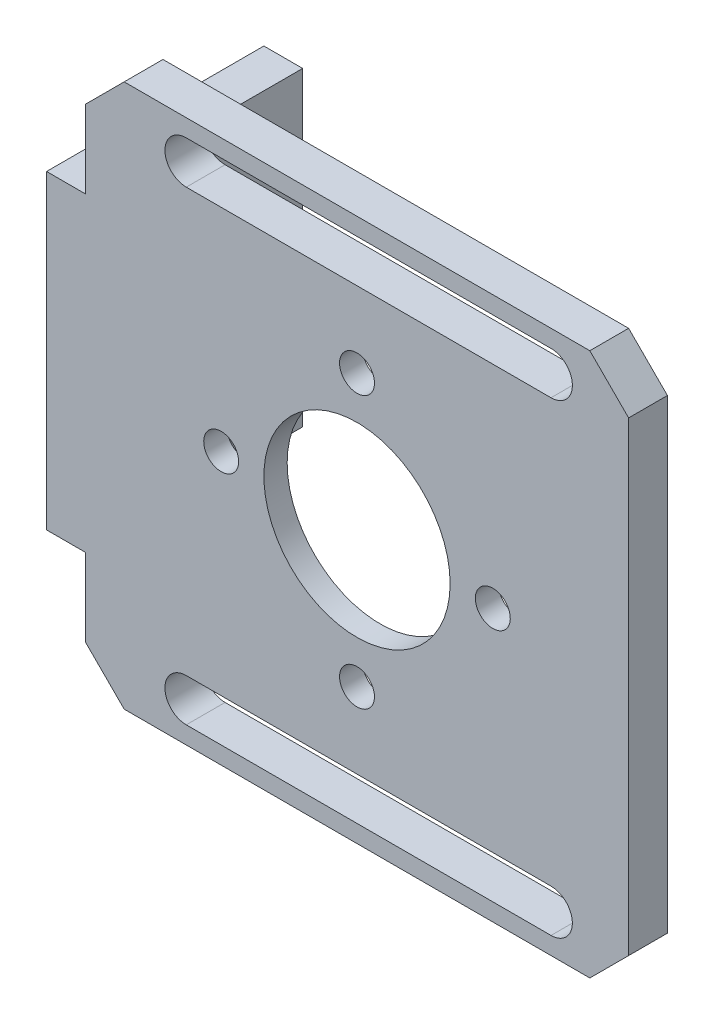
ISO-10303-21;
HEADER;
FILE_DESCRIPTION(('STEP AP214'),'2;1');
FILE_NAME('part.step','',(''),(''),'','','');
FILE_SCHEMA(('AUTOMOTIVE_DESIGN { 1 0 10303 214 1 1 1 1 }'));
ENDSEC;
DATA;
#1=APPLICATION_CONTEXT('core data for automotive mechanical design processes');
#2=APPLICATION_PROTOCOL_DEFINITION('international standard','automotive_design',2000,#1);
#3=PRODUCT_CONTEXT('',#1,'mechanical');
#4=PRODUCT('Part','Part','',(#3));
#5=PRODUCT_RELATED_PRODUCT_CATEGORY('part','',(#4));
#6=PRODUCT_DEFINITION_FORMATION('','',#4);
#7=PRODUCT_DEFINITION_CONTEXT('part definition',#1,'design');
#8=PRODUCT_DEFINITION('design','',#6,#7);
#9=PRODUCT_DEFINITION_SHAPE('','',#8);
#10=(LENGTH_UNIT() NAMED_UNIT(*) SI_UNIT(.MILLI.,.METRE.));
#11=(NAMED_UNIT(*) PLANE_ANGLE_UNIT() SI_UNIT($,.RADIAN.));
#12=(NAMED_UNIT(*) SI_UNIT($,.STERADIAN.) SOLID_ANGLE_UNIT());
#13=UNCERTAINTY_MEASURE_WITH_UNIT(LENGTH_MEASURE(1.E-05),#10,'distance_accuracy_value','');
#14=(GEOMETRIC_REPRESENTATION_CONTEXT(3) GLOBAL_UNCERTAINTY_ASSIGNED_CONTEXT((#13)) GLOBAL_UNIT_ASSIGNED_CONTEXT((#10,
#11,#12)) REPRESENTATION_CONTEXT('',''));
#15=CARTESIAN_POINT('',(0.,0.,0.));
#16=DIRECTION('',(0.,0.,1.));
#17=DIRECTION('',(1.,0.,0.));
#18=AXIS2_PLACEMENT_3D('',#15,#16,#17);
#19=CARTESIAN_POINT('',(0.,0.,-23.));
#20=DIRECTION('',(0.,0.,1.));
#21=DIRECTION('',(1.,0.,0.));
#22=AXIS2_PLACEMENT_3D('',#19,#20,#21);
#23=CYLINDRICAL_SURFACE('',#22,12.);
#24=CARTESIAN_POINT('',(0.,0.,5.));
#25=DIRECTION('',(0.,0.,1.));
#26=DIRECTION('',(1.,0.,0.));
#27=AXIS2_PLACEMENT_3D('',#24,#25,#26);
#28=CIRCLE('',#27,12.);
#29=CARTESIAN_POINT('',(12.,0.,5.));
#30=VERTEX_POINT('',#29);
#31=EDGE_CURVE('E222',#30,#30,#28,.T.);
#32=ORIENTED_EDGE('',*,*,#31,.T.);
#33=EDGE_LOOP('',(#32));
#34=FACE_BOUND('',#33,.T.);
#35=CARTESIAN_POINT('',(0.,0.,2.));
#36=DIRECTION('',(0.,0.,-1.));
#37=DIRECTION('',(-1.,0.,0.));
#38=AXIS2_PLACEMENT_3D('',#35,#36,#37);
#39=CIRCLE('',#38,12.);
#40=CARTESIAN_POINT('',(-12.,0.,2.));
#41=VERTEX_POINT('',#40);
#42=EDGE_CURVE('E219',#41,#41,#39,.F.);
#43=ORIENTED_EDGE('',*,*,#42,.F.);
#44=EDGE_LOOP('',(#43));
#45=FACE_BOUND('',#44,.T.);
#46=ADVANCED_FACE('F34',(#34,#45),#23,.F.);
#47=CARTESIAN_POINT('',(-35.,35.,5.));
#48=DIRECTION('',(1.,0.,0.));
#49=DIRECTION('',(0.,0.,-1.));
#50=AXIS2_PLACEMENT_3D('',#47,#48,#49);
#51=PLANE('',#50);
#52=DIRECTION('',(0.,0.,1.));
#53=VECTOR('',#52,1.);
#54=CARTESIAN_POINT('',(-35.,-20.,-23.));
#55=LINE('',#54,#53);
#56=CARTESIAN_POINT('',(-35.,-20.,0.));
#57=VERTEX_POINT('',#56);
#58=CARTESIAN_POINT('',(-35.,-20.,5.));
#59=VERTEX_POINT('',#58);
#60=EDGE_CURVE('E43',#57,#59,#55,.T.);
#61=ORIENTED_EDGE('',*,*,#60,.F.);
#62=DIRECTION('',(0.,-1.,0.));
#63=VECTOR('',#62,1.);
#64=CARTESIAN_POINT('',(-35.,35.,0.));
#65=LINE('',#64,#63);
#66=CARTESIAN_POINT('',(-35.,-30.,0.));
#67=VERTEX_POINT('',#66);
#68=EDGE_CURVE('E346',#57,#67,#65,.T.);
#69=ORIENTED_EDGE('',*,*,#68,.T.);
#70=DIRECTION('',(0.,0.,1.));
#71=VECTOR('',#70,1.);
#72=CARTESIAN_POINT('',(-35.,-30.,5.));
#73=LINE('',#72,#71);
#74=CARTESIAN_POINT('',(-35.,-30.,5.));
#75=VERTEX_POINT('',#74);
#76=EDGE_CURVE('E179',#67,#75,#73,.T.);
#77=ORIENTED_EDGE('',*,*,#76,.T.);
#78=DIRECTION('',(0.,-1.,0.));
#79=VECTOR('',#78,1.);
#80=CARTESIAN_POINT('',(-35.,35.,5.));
#81=LINE('',#80,#79);
#82=EDGE_CURVE('E176',#59,#75,#81,.T.);
#83=ORIENTED_EDGE('',*,*,#82,.F.);
#84=EDGE_LOOP('',(#61,#69,#77,#83));
#85=FACE_BOUND('',#84,.T.);
#86=ADVANCED_FACE('F177',(#85),#51,.F.);
#87=CARTESIAN_POINT('',(-35.,-35.,5.));
#88=DIRECTION('',(0.,0.,1.));
#89=DIRECTION('',(1.,0.,0.));
#90=AXIS2_PLACEMENT_3D('',#87,#88,#89);
#91=PLANE('',#90);
#92=CARTESIAN_POINT('',(-17.5,-1.83302876458243E-13,5.));
#93=DIRECTION('',(0.,0.,1.));
#94=DIRECTION('',(0.,-1.,0.));
#95=AXIS2_PLACEMENT_3D('',#92,#93,#94);
#96=CIRCLE('',#95,2.25);
#97=CARTESIAN_POINT('',(-17.5,-2.25000000000018,5.));
#98=VERTEX_POINT('',#97);
#99=EDGE_CURVE('E244',#98,#98,#96,.T.);
#100=ORIENTED_EDGE('',*,*,#99,.F.);
#101=EDGE_LOOP('',(#100));
#102=FACE_BOUND('',#101,.T.);
#103=CARTESIAN_POINT('',(-1.22201917638828E-13,17.5,5.));
#104=DIRECTION('',(0.,0.,1.));
#105=DIRECTION('',(-1.,0.,0.));
#106=AXIS2_PLACEMENT_3D('',#103,#104,#105);
#107=CIRCLE('',#106,2.25);
#108=CARTESIAN_POINT('',(-2.25000000000012,17.5,5.));
#109=VERTEX_POINT('',#108);
#110=EDGE_CURVE('E234',#109,#109,#107,.T.);
#111=ORIENTED_EDGE('',*,*,#110,.F.);
#112=EDGE_LOOP('',(#111));
#113=FACE_BOUND('',#112,.T.);
#114=CARTESIAN_POINT('',(17.5,0.,5.));
#115=DIRECTION('',(0.,0.,1.));
#116=DIRECTION('',(0.,1.,0.));
#117=AXIS2_PLACEMENT_3D('',#114,#115,#116);
#118=CIRCLE('',#117,2.25);
#119=CARTESIAN_POINT('',(17.5,2.25000000000006,5.));
#120=VERTEX_POINT('',#119);
#121=EDGE_CURVE('E231',#120,#120,#118,.T.);
#122=ORIENTED_EDGE('',*,*,#121,.F.);
#123=EDGE_LOOP('',(#122));
#124=FACE_BOUND('',#123,.T.);
#125=CARTESIAN_POINT('',(0.,-17.5,5.));
#126=DIRECTION('',(0.,0.,1.));
#127=DIRECTION('',(1.,0.,0.));
#128=AXIS2_PLACEMENT_3D('',#125,#126,#127);
#129=CIRCLE('',#128,2.25);
#130=CARTESIAN_POINT('',(2.25,-17.5,5.));
#131=VERTEX_POINT('',#130);
#132=EDGE_CURVE('E228',#131,#131,#129,.T.);
#133=ORIENTED_EDGE('',*,*,#132,.F.);
#134=EDGE_LOOP('',(#133));
#135=FACE_BOUND('',#134,.T.);
#136=ORIENTED_EDGE('',*,*,#31,.F.);
#137=EDGE_LOOP('',(#136));
#138=FACE_BOUND('',#137,.T.);
#139=DIRECTION('',(1.,0.,0.));
#140=VECTOR('',#139,1.);
#141=CARTESIAN_POINT('',(-22.,27.25,5.));
#142=LINE('',#141,#140);
#143=CARTESIAN_POINT('',(-22.,27.25,5.));
#144=VERTEX_POINT('',#143);
#145=CARTESIAN_POINT('',(25.,27.25,5.));
#146=VERTEX_POINT('',#145);
#147=EDGE_CURVE('E362',#144,#146,#142,.T.);
#148=ORIENTED_EDGE('',*,*,#147,.F.);
#149=CARTESIAN_POINT('',(-22.,30.,5.));
#150=DIRECTION('',(0.,0.,1.));
#151=DIRECTION('',(1.,0.,0.));
#152=AXIS2_PLACEMENT_3D('',#149,#150,#151);
#153=CIRCLE('',#152,2.75);
#154=CARTESIAN_POINT('',(-22.,32.75,5.));
#155=VERTEX_POINT('',#154);
#156=EDGE_CURVE('E364',#155,#144,#153,.T.);
#157=ORIENTED_EDGE('',*,*,#156,.F.);
#158=DIRECTION('',(-1.,0.,0.));
#159=VECTOR('',#158,1.);
#160=CARTESIAN_POINT('',(-22.,32.75,5.));
#161=LINE('',#160,#159);
#162=CARTESIAN_POINT('',(25.,32.75,5.));
#163=VERTEX_POINT('',#162);
#164=EDGE_CURVE('E357',#163,#155,#161,.T.);
#165=ORIENTED_EDGE('',*,*,#164,.F.);
#166=CARTESIAN_POINT('',(25.,30.,5.));
#167=DIRECTION('',(0.,0.,1.));
#168=DIRECTION('',(-1.,0.,0.));
#169=AXIS2_PLACEMENT_3D('',#166,#167,#168);
#170=CIRCLE('',#169,2.75);
#171=EDGE_CURVE('E359',#146,#163,#170,.T.);
#172=ORIENTED_EDGE('',*,*,#171,.F.);
#173=EDGE_LOOP('',(#148,#157,#165,#172));
#174=FACE_BOUND('',#173,.T.);
#175=DIRECTION('',(-1.,0.,0.));
#176=VECTOR('',#175,1.);
#177=CARTESIAN_POINT('',(-35.,35.,5.));
#178=LINE('',#177,#176);
#179=CARTESIAN_POINT('',(30.,35.,5.));
#180=VERTEX_POINT('',#179);
#181=CARTESIAN_POINT('',(-30.,35.,5.));
#182=VERTEX_POINT('',#181);
#183=EDGE_CURVE('E290',#180,#182,#178,.T.);
#184=ORIENTED_EDGE('',*,*,#183,.T.);
#185=DIRECTION('',(0.70710678118655,0.707106781186546,0.));
#186=VECTOR('',#185,1.);
#187=CARTESIAN_POINT('',(-67.5,-2.49999999999981,5.));
#188=LINE('',#187,#186);
#189=CARTESIAN_POINT('',(-35.,30.,5.));
#190=VERTEX_POINT('',#189);
#191=EDGE_CURVE('E316',#182,#190,#188,.F.);
#192=ORIENTED_EDGE('',*,*,#191,.T.);
#193=CARTESIAN_POINT('',(-35.,20.,5.));
#194=VERTEX_POINT('',#193);
#195=EDGE_CURVE('E183',#190,#194,#81,.T.);
#196=ORIENTED_EDGE('',*,*,#195,.T.);
#197=DIRECTION('',(1.,0.,0.));
#198=VECTOR('',#197,1.);
#199=CARTESIAN_POINT('',(-35.,20.,5.));
#200=LINE('',#199,#198);
#201=CARTESIAN_POINT('',(-40.,20.,5.));
#202=VERTEX_POINT('',#201);
#203=EDGE_CURVE('E205',#202,#194,#200,.T.);
#204=ORIENTED_EDGE('',*,*,#203,.F.);
#205=DIRECTION('',(0.,1.,0.));
#206=VECTOR('',#205,1.);
#207=CARTESIAN_POINT('',(-40.,-20.,5.));
#208=LINE('',#207,#206);
#209=CARTESIAN_POINT('',(-40.,-20.,5.));
#210=VERTEX_POINT('',#209);
#211=EDGE_CURVE('E202',#210,#202,#208,.T.);
#212=ORIENTED_EDGE('',*,*,#211,.F.);
#213=DIRECTION('',(-1.,0.,0.));
#214=VECTOR('',#213,1.);
#215=CARTESIAN_POINT('',(-35.,-20.,5.));
#216=LINE('',#215,#214);
#217=EDGE_CURVE('E191',#59,#210,#216,.T.);
#218=ORIENTED_EDGE('',*,*,#217,.F.);
#219=ORIENTED_EDGE('',*,*,#82,.T.);
#220=DIRECTION('',(-0.707106781186546,0.70710678118655,0.));
#221=VECTOR('',#220,1.);
#222=CARTESIAN_POINT('',(-32.5,-32.5,5.));
#223=LINE('',#222,#221);
#224=CARTESIAN_POINT('',(-30.,-35.,5.));
#225=VERTEX_POINT('',#224);
#226=EDGE_CURVE('E314',#75,#225,#223,.F.);
#227=ORIENTED_EDGE('',*,*,#226,.T.);
#228=DIRECTION('',(1.,0.,0.));
#229=VECTOR('',#228,1.);
#230=CARTESIAN_POINT('',(-35.,-35.,5.));
#231=LINE('',#230,#229);
#232=CARTESIAN_POINT('',(30.,-35.,5.));
#233=VERTEX_POINT('',#232);
#234=EDGE_CURVE('E283',#225,#233,#231,.T.);
#235=ORIENTED_EDGE('',*,*,#234,.T.);
#236=DIRECTION('',(-0.707106781186549,-0.707106781186546,0.));
#237=VECTOR('',#236,1.);
#238=CARTESIAN_POINT('',(-2.50000000000018,-67.5,5.));
#239=LINE('',#238,#237);
#240=CARTESIAN_POINT('',(35.,-30.,5.));
#241=VERTEX_POINT('',#240);
#242=EDGE_CURVE('E312',#233,#241,#239,.F.);
#243=ORIENTED_EDGE('',*,*,#242,.T.);
#244=DIRECTION('',(0.,1.,0.));
#245=VECTOR('',#244,1.);
#246=CARTESIAN_POINT('',(35.,35.,5.));
#247=LINE('',#246,#245);
#248=CARTESIAN_POINT('',(35.,30.,5.));
#249=VERTEX_POINT('',#248);
#250=EDGE_CURVE('E287',#241,#249,#247,.T.);
#251=ORIENTED_EDGE('',*,*,#250,.T.);
#252=DIRECTION('',(0.707106781186547,-0.707106781186549,0.));
#253=VECTOR('',#252,1.);
#254=CARTESIAN_POINT('',(32.5000000000001,32.4999999999999,5.));
#255=LINE('',#254,#253);
#256=EDGE_CURVE('E310',#249,#180,#255,.F.);
#257=ORIENTED_EDGE('',*,*,#256,.T.);
#258=EDGE_LOOP('',(#184,#192,#196,#204,#212,#218,#219,#227,#235,#243,#251,#257));
#259=FACE_BOUND('',#258,.T.);
#260=DIRECTION('',(-1.,0.,0.));
#261=VECTOR('',#260,1.);
#262=CARTESIAN_POINT('',(-22.,-27.25,5.));
#263=LINE('',#262,#261);
#264=CARTESIAN_POINT('',(25.,-27.25,5.));
#265=VERTEX_POINT('',#264);
#266=CARTESIAN_POINT('',(-22.,-27.25,5.));
#267=VERTEX_POINT('',#266);
#268=EDGE_CURVE('E393',#265,#267,#263,.T.);
#269=ORIENTED_EDGE('',*,*,#268,.F.);
#270=CARTESIAN_POINT('',(25.,-30.,5.));
#271=DIRECTION('',(0.,0.,1.));
#272=DIRECTION('',(1.,0.,0.));
#273=AXIS2_PLACEMENT_3D('',#270,#271,#272);
#274=CIRCLE('',#273,2.75);
#275=CARTESIAN_POINT('',(25.,-32.75,5.));
#276=VERTEX_POINT('',#275);
#277=EDGE_CURVE('E395',#276,#265,#274,.T.);
#278=ORIENTED_EDGE('',*,*,#277,.F.);
#279=DIRECTION('',(1.,0.,0.));
#280=VECTOR('',#279,1.);
#281=CARTESIAN_POINT('',(-22.,-32.75,5.));
#282=LINE('',#281,#280);
#283=CARTESIAN_POINT('',(-22.,-32.75,5.));
#284=VERTEX_POINT('',#283);
#285=EDGE_CURVE('E388',#284,#276,#282,.T.);
#286=ORIENTED_EDGE('',*,*,#285,.F.);
#287=CARTESIAN_POINT('',(-22.,-30.,5.));
#288=DIRECTION('',(0.,0.,1.));
#289=DIRECTION('',(-1.,0.,0.));
#290=AXIS2_PLACEMENT_3D('',#287,#288,#289);
#291=CIRCLE('',#290,2.75);
#292=EDGE_CURVE('E390',#267,#284,#291,.T.);
#293=ORIENTED_EDGE('',*,*,#292,.F.);
#294=EDGE_LOOP('',(#269,#278,#286,#293));
#295=FACE_BOUND('',#294,.T.);
#296=ADVANCED_FACE('F198',(#102,#113,#124,#135,#138,#174,#259,#295),#91,.T.);
#297=CARTESIAN_POINT('',(-35.,-35.,0.));
#298=DIRECTION('',(0.,0.,1.));
#299=DIRECTION('',(1.,0.,0.));
#300=AXIS2_PLACEMENT_3D('',#297,#298,#299);
#301=PLANE('',#300);
#302=CARTESIAN_POINT('',(0.,0.,0.));
#303=DIRECTION('',(0.,0.,-1.));
#304=DIRECTION('',(-1.,0.,0.));
#305=AXIS2_PLACEMENT_3D('',#302,#303,#304);
#306=CIRCLE('',#305,23.5);
#307=CARTESIAN_POINT('',(-23.5,0.,0.));
#308=VERTEX_POINT('',#307);
#309=EDGE_CURVE('E227',#308,#308,#306,.T.);
#310=ORIENTED_EDGE('',*,*,#309,.F.);
#311=EDGE_LOOP('',(#310));
#312=FACE_BOUND('',#311,.T.);
#313=CARTESIAN_POINT('',(-22.,30.,0.));
#314=DIRECTION('',(0.,0.,1.));
#315=DIRECTION('',(1.,0.,0.));
#316=AXIS2_PLACEMENT_3D('',#313,#314,#315);
#317=CIRCLE('',#316,2.75);
#318=CARTESIAN_POINT('',(-22.,32.75,0.));
#319=VERTEX_POINT('',#318);
#320=CARTESIAN_POINT('',(-22.,27.25,0.));
#321=VERTEX_POINT('',#320);
#322=EDGE_CURVE('E375',#319,#321,#317,.T.);
#323=ORIENTED_EDGE('',*,*,#322,.T.);
#324=DIRECTION('',(1.,0.,0.));
#325=VECTOR('',#324,1.);
#326=CARTESIAN_POINT('',(-22.,27.25,0.));
#327=LINE('',#326,#325);
#328=CARTESIAN_POINT('',(25.,27.25,0.));
#329=VERTEX_POINT('',#328);
#330=EDGE_CURVE('E372',#321,#329,#327,.T.);
#331=ORIENTED_EDGE('',*,*,#330,.T.);
#332=CARTESIAN_POINT('',(25.,30.,0.));
#333=DIRECTION('',(0.,0.,1.));
#334=DIRECTION('',(-1.,0.,0.));
#335=AXIS2_PLACEMENT_3D('',#332,#333,#334);
#336=CIRCLE('',#335,2.75);
#337=CARTESIAN_POINT('',(25.,32.75,0.));
#338=VERTEX_POINT('',#337);
#339=EDGE_CURVE('E369',#329,#338,#336,.T.);
#340=ORIENTED_EDGE('',*,*,#339,.T.);
#341=DIRECTION('',(-1.,0.,0.));
#342=VECTOR('',#341,1.);
#343=CARTESIAN_POINT('',(-22.,32.75,0.));
#344=LINE('',#343,#342);
#345=EDGE_CURVE('E366',#338,#319,#344,.T.);
#346=ORIENTED_EDGE('',*,*,#345,.T.);
#347=EDGE_LOOP('',(#323,#331,#340,#346));
#348=FACE_BOUND('',#347,.T.);
#349=CARTESIAN_POINT('',(-35.,30.,0.));
#350=VERTEX_POINT('',#349);
#351=CARTESIAN_POINT('',(-35.,20.,0.));
#352=VERTEX_POINT('',#351);
#353=EDGE_CURVE('E342',#350,#352,#65,.T.);
#354=ORIENTED_EDGE('',*,*,#353,.F.);
#355=DIRECTION('',(-0.70710678118655,-0.707106781186546,0.));
#356=VECTOR('',#355,1.);
#357=CARTESIAN_POINT('',(-35.,30.,0.));
#358=LINE('',#357,#356);
#359=CARTESIAN_POINT('',(-30.,35.,0.));
#360=VERTEX_POINT('',#359);
#361=EDGE_CURVE('E303',#350,#360,#358,.F.);
#362=ORIENTED_EDGE('',*,*,#361,.T.);
#363=DIRECTION('',(-1.,0.,0.));
#364=VECTOR('',#363,1.);
#365=CARTESIAN_POINT('',(-35.,35.,0.));
#366=LINE('',#365,#364);
#367=CARTESIAN_POINT('',(30.,35.,0.));
#368=VERTEX_POINT('',#367);
#369=EDGE_CURVE('E184',#368,#360,#366,.T.);
#370=ORIENTED_EDGE('',*,*,#369,.F.);
#371=DIRECTION('',(-0.707106781186547,0.707106781186549,0.));
#372=VECTOR('',#371,1.);
#373=CARTESIAN_POINT('',(30.,35.,0.));
#374=LINE('',#373,#372);
#375=CARTESIAN_POINT('',(35.,30.,0.));
#376=VERTEX_POINT('',#375);
#377=EDGE_CURVE('E296',#368,#376,#374,.F.);
#378=ORIENTED_EDGE('',*,*,#377,.T.);
#379=DIRECTION('',(0.,1.,0.));
#380=VECTOR('',#379,1.);
#381=CARTESIAN_POINT('',(35.,35.,0.));
#382=LINE('',#381,#380);
#383=CARTESIAN_POINT('',(35.,-30.,0.));
#384=VERTEX_POINT('',#383);
#385=EDGE_CURVE('E331',#384,#376,#382,.T.);
#386=ORIENTED_EDGE('',*,*,#385,.F.);
#387=DIRECTION('',(0.707106781186549,0.707106781186546,0.));
#388=VECTOR('',#387,1.);
#389=CARTESIAN_POINT('',(35.,-30.,0.));
#390=LINE('',#389,#388);
#391=CARTESIAN_POINT('',(30.,-35.,0.));
#392=VERTEX_POINT('',#391);
#393=EDGE_CURVE('E298',#384,#392,#390,.F.);
#394=ORIENTED_EDGE('',*,*,#393,.T.);
#395=DIRECTION('',(1.,0.,0.));
#396=VECTOR('',#395,1.);
#397=CARTESIAN_POINT('',(-35.,-35.,0.));
#398=LINE('',#397,#396);
#399=CARTESIAN_POINT('',(-30.,-35.,0.));
#400=VERTEX_POINT('',#399);
#401=EDGE_CURVE('E340',#400,#392,#398,.T.);
#402=ORIENTED_EDGE('',*,*,#401,.F.);
#403=DIRECTION('',(0.707106781186546,-0.70710678118655,0.));
#404=VECTOR('',#403,1.);
#405=CARTESIAN_POINT('',(-30.,-35.,0.));
#406=LINE('',#405,#404);
#407=EDGE_CURVE('E300',#400,#67,#406,.F.);
#408=ORIENTED_EDGE('',*,*,#407,.T.);
#409=ORIENTED_EDGE('',*,*,#68,.F.);
#410=EDGE_CURVE('E57',#352,#57,#65,.T.);
#411=ORIENTED_EDGE('',*,*,#410,.F.);
#412=EDGE_LOOP('',(#354,#362,#370,#378,#386,#394,#402,#408,#409,#411));
#413=FACE_BOUND('',#412,.T.);
#414=CARTESIAN_POINT('',(25.,-30.,0.));
#415=DIRECTION('',(0.,0.,1.));
#416=DIRECTION('',(1.,0.,0.));
#417=AXIS2_PLACEMENT_3D('',#414,#415,#416);
#418=CIRCLE('',#417,2.75);
#419=CARTESIAN_POINT('',(25.,-32.75,0.));
#420=VERTEX_POINT('',#419);
#421=CARTESIAN_POINT('',(25.,-27.25,0.));
#422=VERTEX_POINT('',#421);
#423=EDGE_CURVE('E274',#420,#422,#418,.T.);
#424=ORIENTED_EDGE('',*,*,#423,.T.);
#425=DIRECTION('',(-1.,0.,0.));
#426=VECTOR('',#425,1.);
#427=CARTESIAN_POINT('',(-22.,-27.25,0.));
#428=LINE('',#427,#426);
#429=CARTESIAN_POINT('',(-22.,-27.25,0.));
#430=VERTEX_POINT('',#429);
#431=EDGE_CURVE('E402',#422,#430,#428,.T.);
#432=ORIENTED_EDGE('',*,*,#431,.T.);
#433=CARTESIAN_POINT('',(-22.,-30.,0.));
#434=DIRECTION('',(0.,0.,1.));
#435=DIRECTION('',(-1.,0.,0.));
#436=AXIS2_PLACEMENT_3D('',#433,#434,#435);
#437=CIRCLE('',#436,2.75);
#438=CARTESIAN_POINT('',(-22.,-32.75,0.));
#439=VERTEX_POINT('',#438);
#440=EDGE_CURVE('E400',#430,#439,#437,.T.);
#441=ORIENTED_EDGE('',*,*,#440,.T.);
#442=DIRECTION('',(1.,0.,0.));
#443=VECTOR('',#442,1.);
#444=CARTESIAN_POINT('',(-22.,-32.75,0.));
#445=LINE('',#444,#443);
#446=EDGE_CURVE('E397',#439,#420,#445,.T.);
#447=ORIENTED_EDGE('',*,*,#446,.T.);
#448=EDGE_LOOP('',(#424,#432,#441,#447));
#449=FACE_BOUND('',#448,.T.);
#450=ADVANCED_FACE('F335',(#312,#348,#413,#449),#301,.F.);
#451=ORIENTED_EDGE('',*,*,#353,.T.);
#452=DIRECTION('',(0.,0.,1.));
#453=VECTOR('',#452,1.);
#454=CARTESIAN_POINT('',(-35.,20.,-23.));
#455=LINE('',#454,#453);
#456=EDGE_CURVE('E11',#352,#194,#455,.T.);
#457=ORIENTED_EDGE('',*,*,#456,.T.);
#458=ORIENTED_EDGE('',*,*,#195,.F.);
#459=DIRECTION('',(0.,0.,-1.));
#460=VECTOR('',#459,1.);
#461=CARTESIAN_POINT('',(-35.,30.,5.));
#462=LINE('',#461,#460);
#463=EDGE_CURVE('E293',#190,#350,#462,.T.);
#464=ORIENTED_EDGE('',*,*,#463,.T.);
#465=EDGE_LOOP('',(#451,#457,#458,#464));
#466=FACE_BOUND('',#465,.T.);
#467=ADVANCED_FACE('F36',(#466),#51,.F.);
#468=CARTESIAN_POINT('',(-35.,-35.,5.));
#469=DIRECTION('',(0.,1.,0.));
#470=DIRECTION('',(0.,0.,1.));
#471=AXIS2_PLACEMENT_3D('',#468,#469,#470);
#472=PLANE('',#471);
#473=ORIENTED_EDGE('',*,*,#234,.F.);
#474=DIRECTION('',(0.,0.,-1.));
#475=VECTOR('',#474,1.);
#476=CARTESIAN_POINT('',(-30.,-35.,5.));
#477=LINE('',#476,#475);
#478=EDGE_CURVE('E320',#225,#400,#477,.T.);
#479=ORIENTED_EDGE('',*,*,#478,.T.);
#480=ORIENTED_EDGE('',*,*,#401,.T.);
#481=DIRECTION('',(0.,0.,1.));
#482=VECTOR('',#481,1.);
#483=CARTESIAN_POINT('',(30.,-35.,5.));
#484=LINE('',#483,#482);
#485=EDGE_CURVE('E318',#392,#233,#484,.T.);
#486=ORIENTED_EDGE('',*,*,#485,.T.);
#487=EDGE_LOOP('',(#473,#479,#480,#486));
#488=FACE_BOUND('',#487,.T.);
#489=ADVANCED_FACE('F498',(#488),#472,.F.);
#490=CARTESIAN_POINT('',(35.,35.,5.));
#491=DIRECTION('',(-1.,0.,0.));
#492=DIRECTION('',(0.,-1.,0.));
#493=AXIS2_PLACEMENT_3D('',#490,#491,#492);
#494=PLANE('',#493);
#495=ORIENTED_EDGE('',*,*,#250,.F.);
#496=DIRECTION('',(0.,0.,-1.));
#497=VECTOR('',#496,1.);
#498=CARTESIAN_POINT('',(35.,-30.,5.));
#499=LINE('',#498,#497);
#500=EDGE_CURVE('E194',#241,#384,#499,.T.);
#501=ORIENTED_EDGE('',*,*,#500,.T.);
#502=ORIENTED_EDGE('',*,*,#385,.T.);
#503=DIRECTION('',(0.,0.,1.));
#504=VECTOR('',#503,1.);
#505=CARTESIAN_POINT('',(35.,30.,5.));
#506=LINE('',#505,#504);
#507=EDGE_CURVE('E323',#376,#249,#506,.T.);
#508=ORIENTED_EDGE('',*,*,#507,.T.);
#509=EDGE_LOOP('',(#495,#501,#502,#508));
#510=FACE_BOUND('',#509,.T.);
#511=ADVANCED_FACE('F330',(#510),#494,.F.);
#512=CARTESIAN_POINT('',(-35.,35.,5.));
#513=DIRECTION('',(0.,-1.,0.));
#514=DIRECTION('',(0.,0.,-1.));
#515=AXIS2_PLACEMENT_3D('',#512,#513,#514);
#516=PLANE('',#515);
#517=ORIENTED_EDGE('',*,*,#369,.T.);
#518=DIRECTION('',(0.,0.,1.));
#519=VECTOR('',#518,1.);
#520=CARTESIAN_POINT('',(-30.,35.,5.));
#521=LINE('',#520,#519);
#522=EDGE_CURVE('E308',#360,#182,#521,.T.);
#523=ORIENTED_EDGE('',*,*,#522,.T.);
#524=ORIENTED_EDGE('',*,*,#183,.F.);
#525=DIRECTION('',(0.,0.,-1.));
#526=VECTOR('',#525,1.);
#527=CARTESIAN_POINT('',(30.,35.,5.));
#528=LINE('',#527,#526);
#529=EDGE_CURVE('E305',#180,#368,#528,.T.);
#530=ORIENTED_EDGE('',*,*,#529,.T.);
#531=EDGE_LOOP('',(#517,#523,#524,#530));
#532=FACE_BOUND('',#531,.T.);
#533=ADVANCED_FACE('F503',(#532),#516,.F.);
#534=CARTESIAN_POINT('',(-22.,30.,5.));
#535=DIRECTION('',(0.,0.,-1.));
#536=DIRECTION('',(-1.,0.,0.));
#537=AXIS2_PLACEMENT_3D('',#534,#535,#536);
#538=CYLINDRICAL_SURFACE('',#537,2.75);
#539=ORIENTED_EDGE('',*,*,#322,.F.);
#540=DIRECTION('',(0.,0.,-1.));
#541=VECTOR('',#540,1.);
#542=CARTESIAN_POINT('',(-22.,32.75,5.));
#543=LINE('',#542,#541);
#544=EDGE_CURVE('E354',#155,#319,#543,.T.);
#545=ORIENTED_EDGE('',*,*,#544,.F.);
#546=ORIENTED_EDGE('',*,*,#156,.T.);
#547=DIRECTION('',(0.,0.,-1.));
#548=VECTOR('',#547,1.);
#549=CARTESIAN_POINT('',(-22.,27.25,5.));
#550=LINE('',#549,#548);
#551=EDGE_CURVE('E347',#144,#321,#550,.T.);
#552=ORIENTED_EDGE('',*,*,#551,.T.);
#553=EDGE_LOOP('',(#539,#545,#546,#552));
#554=FACE_BOUND('',#553,.T.);
#555=ADVANCED_FACE('F505',(#554),#538,.F.);
#556=CARTESIAN_POINT('',(-22.,27.25,5.));
#557=DIRECTION('',(0.,1.,0.));
#558=DIRECTION('',(0.,0.,1.));
#559=AXIS2_PLACEMENT_3D('',#556,#557,#558);
#560=PLANE('',#559);
#561=ORIENTED_EDGE('',*,*,#330,.F.);
#562=ORIENTED_EDGE('',*,*,#551,.F.);
#563=ORIENTED_EDGE('',*,*,#147,.T.);
#564=DIRECTION('',(0.,0.,-1.));
#565=VECTOR('',#564,1.);
#566=CARTESIAN_POINT('',(25.,27.25,5.));
#567=LINE('',#566,#565);
#568=EDGE_CURVE('E350',#146,#329,#567,.T.);
#569=ORIENTED_EDGE('',*,*,#568,.T.);
#570=EDGE_LOOP('',(#561,#562,#563,#569));
#571=FACE_BOUND('',#570,.T.);
#572=ADVANCED_FACE('F511',(#571),#560,.T.);
#573=CARTESIAN_POINT('',(25.,30.,5.));
#574=DIRECTION('',(0.,0.,-1.));
#575=DIRECTION('',(-1.,0.,0.));
#576=AXIS2_PLACEMENT_3D('',#573,#574,#575);
#577=CYLINDRICAL_SURFACE('',#576,2.75);
#578=ORIENTED_EDGE('',*,*,#339,.F.);
#579=ORIENTED_EDGE('',*,*,#568,.F.);
#580=ORIENTED_EDGE('',*,*,#171,.T.);
#581=DIRECTION('',(0.,0.,-1.));
#582=VECTOR('',#581,1.);
#583=CARTESIAN_POINT('',(25.,32.75,5.));
#584=LINE('',#583,#582);
#585=EDGE_CURVE('E352',#163,#338,#584,.T.);
#586=ORIENTED_EDGE('',*,*,#585,.T.);
#587=EDGE_LOOP('',(#578,#579,#580,#586));
#588=FACE_BOUND('',#587,.T.);
#589=ADVANCED_FACE('F534',(#588),#577,.F.);
#590=CARTESIAN_POINT('',(-22.,32.75,5.));
#591=DIRECTION('',(0.,-1.,0.));
#592=DIRECTION('',(0.,0.,-1.));
#593=AXIS2_PLACEMENT_3D('',#590,#591,#592);
#594=PLANE('',#593);
#595=ORIENTED_EDGE('',*,*,#345,.F.);
#596=ORIENTED_EDGE('',*,*,#585,.F.);
#597=ORIENTED_EDGE('',*,*,#164,.T.);
#598=ORIENTED_EDGE('',*,*,#544,.T.);
#599=EDGE_LOOP('',(#595,#596,#597,#598));
#600=FACE_BOUND('',#599,.T.);
#601=ADVANCED_FACE('F538',(#600),#594,.T.);
#602=CARTESIAN_POINT('',(25.,-30.,5.));
#603=DIRECTION('',(0.,0.,-1.));
#604=DIRECTION('',(-1.,0.,0.));
#605=AXIS2_PLACEMENT_3D('',#602,#603,#604);
#606=CYLINDRICAL_SURFACE('',#605,2.75);
#607=ORIENTED_EDGE('',*,*,#423,.F.);
#608=DIRECTION('',(0.,0.,-1.));
#609=VECTOR('',#608,1.);
#610=CARTESIAN_POINT('',(25.,-32.75,5.));
#611=LINE('',#610,#609);
#612=EDGE_CURVE('E385',#276,#420,#611,.T.);
#613=ORIENTED_EDGE('',*,*,#612,.F.);
#614=ORIENTED_EDGE('',*,*,#277,.T.);
#615=DIRECTION('',(0.,0.,-1.));
#616=VECTOR('',#615,1.);
#617=CARTESIAN_POINT('',(25.,-27.25,5.));
#618=LINE('',#617,#616);
#619=EDGE_CURVE('E378',#265,#422,#618,.T.);
#620=ORIENTED_EDGE('',*,*,#619,.T.);
#621=EDGE_LOOP('',(#607,#613,#614,#620));
#622=FACE_BOUND('',#621,.T.);
#623=ADVANCED_FACE('F408',(#622),#606,.F.);
#624=CARTESIAN_POINT('',(-22.,-27.25,5.));
#625=DIRECTION('',(0.,-1.,0.));
#626=DIRECTION('',(1.,0.,0.));
#627=AXIS2_PLACEMENT_3D('',#624,#625,#626);
#628=PLANE('',#627);
#629=ORIENTED_EDGE('',*,*,#431,.F.);
#630=ORIENTED_EDGE('',*,*,#619,.F.);
#631=ORIENTED_EDGE('',*,*,#268,.T.);
#632=DIRECTION('',(0.,0.,-1.));
#633=VECTOR('',#632,1.);
#634=CARTESIAN_POINT('',(-22.,-27.25,5.));
#635=LINE('',#634,#633);
#636=EDGE_CURVE('E381',#267,#430,#635,.T.);
#637=ORIENTED_EDGE('',*,*,#636,.T.);
#638=EDGE_LOOP('',(#629,#630,#631,#637));
#639=FACE_BOUND('',#638,.T.);
#640=ADVANCED_FACE('F417',(#639),#628,.T.);
#641=CARTESIAN_POINT('',(-22.,-30.,5.));
#642=DIRECTION('',(0.,0.,-1.));
#643=DIRECTION('',(-1.,0.,0.));
#644=AXIS2_PLACEMENT_3D('',#641,#642,#643);
#645=CYLINDRICAL_SURFACE('',#644,2.75);
#646=ORIENTED_EDGE('',*,*,#440,.F.);
#647=ORIENTED_EDGE('',*,*,#636,.F.);
#648=ORIENTED_EDGE('',*,*,#292,.T.);
#649=DIRECTION('',(0.,0.,-1.));
#650=VECTOR('',#649,1.);
#651=CARTESIAN_POINT('',(-22.,-32.75,5.));
#652=LINE('',#651,#650);
#653=EDGE_CURVE('E383',#284,#439,#652,.T.);
#654=ORIENTED_EDGE('',*,*,#653,.T.);
#655=EDGE_LOOP('',(#646,#647,#648,#654));
#656=FACE_BOUND('',#655,.T.);
#657=ADVANCED_FACE('F421',(#656),#645,.F.);
#658=CARTESIAN_POINT('',(-22.,-32.75,5.));
#659=DIRECTION('',(0.,1.,0.));
#660=DIRECTION('',(-1.,0.,0.));
#661=AXIS2_PLACEMENT_3D('',#658,#659,#660);
#662=PLANE('',#661);
#663=ORIENTED_EDGE('',*,*,#446,.F.);
#664=ORIENTED_EDGE('',*,*,#653,.F.);
#665=ORIENTED_EDGE('',*,*,#285,.T.);
#666=ORIENTED_EDGE('',*,*,#612,.T.);
#667=EDGE_LOOP('',(#663,#664,#665,#666));
#668=FACE_BOUND('',#667,.T.);
#669=ADVANCED_FACE('F412',(#668),#662,.T.);
#670=CARTESIAN_POINT('',(-35.,30.,5.));
#671=DIRECTION('',(0.707106781186545,-0.707106781186549,0.));
#672=DIRECTION('',(0.70710678118655,0.707106781186546,0.));
#673=AXIS2_PLACEMENT_3D('',#670,#671,#672);
#674=PLANE('',#673);
#675=ORIENTED_EDGE('',*,*,#191,.F.);
#676=ORIENTED_EDGE('',*,*,#522,.F.);
#677=ORIENTED_EDGE('',*,*,#361,.F.);
#678=ORIENTED_EDGE('',*,*,#463,.F.);
#679=EDGE_LOOP('',(#675,#676,#677,#678));
#680=FACE_BOUND('',#679,.T.);
#681=ADVANCED_FACE('F428',(#680),#674,.F.);
#682=CARTESIAN_POINT('',(-30.,-35.,5.));
#683=DIRECTION('',(0.707106781186549,0.707106781186545,0.));
#684=DIRECTION('',(-0.707106781186546,0.70710678118655,0.));
#685=AXIS2_PLACEMENT_3D('',#682,#683,#684);
#686=PLANE('',#685);
#687=ORIENTED_EDGE('',*,*,#226,.F.);
#688=ORIENTED_EDGE('',*,*,#76,.F.);
#689=ORIENTED_EDGE('',*,*,#407,.F.);
#690=ORIENTED_EDGE('',*,*,#478,.F.);
#691=EDGE_LOOP('',(#687,#688,#689,#690));
#692=FACE_BOUND('',#691,.T.);
#693=ADVANCED_FACE('F472',(#692),#686,.F.);
#694=CARTESIAN_POINT('',(35.,-30.,5.));
#695=DIRECTION('',(-0.707106781186546,0.707106781186549,0.));
#696=DIRECTION('',(-0.707106781186549,-0.707106781186546,0.));
#697=AXIS2_PLACEMENT_3D('',#694,#695,#696);
#698=PLANE('',#697);
#699=ORIENTED_EDGE('',*,*,#242,.F.);
#700=ORIENTED_EDGE('',*,*,#485,.F.);
#701=ORIENTED_EDGE('',*,*,#393,.F.);
#702=ORIENTED_EDGE('',*,*,#500,.F.);
#703=EDGE_LOOP('',(#699,#700,#701,#702));
#704=FACE_BOUND('',#703,.T.);
#705=ADVANCED_FACE('F468',(#704),#698,.F.);
#706=CARTESIAN_POINT('',(30.,35.,5.));
#707=DIRECTION('',(-0.707106781186548,-0.707106781186546,0.));
#708=DIRECTION('',(0.707106781186547,-0.707106781186549,0.));
#709=AXIS2_PLACEMENT_3D('',#706,#707,#708);
#710=PLANE('',#709);
#711=ORIENTED_EDGE('',*,*,#256,.F.);
#712=ORIENTED_EDGE('',*,*,#507,.F.);
#713=ORIENTED_EDGE('',*,*,#377,.F.);
#714=ORIENTED_EDGE('',*,*,#529,.F.);
#715=EDGE_LOOP('',(#711,#712,#713,#714));
#716=FACE_BOUND('',#715,.T.);
#717=ADVANCED_FACE('F464',(#716),#710,.F.);
#718=CARTESIAN_POINT('',(-35.,-20.,-23.));
#719=DIRECTION('',(-1.,0.,0.));
#720=DIRECTION('',(0.,0.,1.));
#721=AXIS2_PLACEMENT_3D('',#718,#719,#720);
#722=PLANE('',#721);
#723=CARTESIAN_POINT('',(-35.,0.,-14.));
#724=DIRECTION('',(1.,0.,0.));
#725=DIRECTION('',(0.,0.,-1.));
#726=AXIS2_PLACEMENT_3D('',#723,#724,#725);
#727=CIRCLE('',#726,3.);
#728=CARTESIAN_POINT('',(-35.,0.,-17.));
#729=VERTEX_POINT('',#728);
#730=EDGE_CURVE('E208',#729,#729,#727,.T.);
#731=ORIENTED_EDGE('',*,*,#730,.F.);
#732=EDGE_LOOP('',(#731));
#733=FACE_BOUND('',#732,.T.);
#734=CARTESIAN_POINT('',(-35.,20.,-23.));
#735=VERTEX_POINT('',#734);
#736=EDGE_CURVE('E264',#735,#352,#455,.T.);
#737=ORIENTED_EDGE('',*,*,#736,.T.);
#738=ORIENTED_EDGE('',*,*,#410,.T.);
#739=CARTESIAN_POINT('',(-35.,-20.,-23.));
#740=VERTEX_POINT('',#739);
#741=EDGE_CURVE('E193',#740,#57,#55,.T.);
#742=ORIENTED_EDGE('',*,*,#741,.F.);
#743=DIRECTION('',(0.,-1.,0.));
#744=VECTOR('',#743,1.);
#745=CARTESIAN_POINT('',(-35.,-20.,-23.));
#746=LINE('',#745,#744);
#747=EDGE_CURVE('E216',#735,#740,#746,.T.);
#748=ORIENTED_EDGE('',*,*,#747,.F.);
#749=EDGE_LOOP('',(#737,#738,#742,#748));
#750=FACE_BOUND('',#749,.T.);
#751=ADVANCED_FACE('F461',(#733,#750),#722,.F.);
#752=CARTESIAN_POINT('',(-35.,-20.,-23.));
#753=DIRECTION('',(0.,1.,0.));
#754=DIRECTION('',(-1.,0.,0.));
#755=AXIS2_PLACEMENT_3D('',#752,#753,#754);
#756=PLANE('',#755);
#757=ORIENTED_EDGE('',*,*,#741,.T.);
#758=ORIENTED_EDGE('',*,*,#60,.T.);
#759=ORIENTED_EDGE('',*,*,#217,.T.);
#760=DIRECTION('',(0.,0.,1.));
#761=VECTOR('',#760,1.);
#762=CARTESIAN_POINT('',(-40.,-20.,-23.));
#763=LINE('',#762,#761);
#764=CARTESIAN_POINT('',(-40.,-20.,-23.));
#765=VERTEX_POINT('',#764);
#766=EDGE_CURVE('E270',#765,#210,#763,.T.);
#767=ORIENTED_EDGE('',*,*,#766,.F.);
#768=DIRECTION('',(-1.,0.,0.));
#769=VECTOR('',#768,1.);
#770=CARTESIAN_POINT('',(-35.,-20.,-23.));
#771=LINE('',#770,#769);
#772=EDGE_CURVE('E259',#740,#765,#771,.T.);
#773=ORIENTED_EDGE('',*,*,#772,.F.);
#774=EDGE_LOOP('',(#757,#758,#759,#767,#773));
#775=FACE_BOUND('',#774,.T.);
#776=ADVANCED_FACE('F189',(#775),#756,.F.);
#777=CARTESIAN_POINT('',(-40.,-20.,-23.));
#778=DIRECTION('',(1.,0.,0.));
#779=DIRECTION('',(0.,0.,-1.));
#780=AXIS2_PLACEMENT_3D('',#777,#778,#779);
#781=PLANE('',#780);
#782=CARTESIAN_POINT('',(-40.,0.,-14.));
#783=DIRECTION('',(1.,0.,0.));
#784=DIRECTION('',(0.,0.,-1.));
#785=AXIS2_PLACEMENT_3D('',#782,#783,#784);
#786=CIRCLE('',#785,3.);
#787=CARTESIAN_POINT('',(-40.,0.,-17.));
#788=VERTEX_POINT('',#787);
#789=EDGE_CURVE('E203',#788,#788,#786,.T.);
#790=ORIENTED_EDGE('',*,*,#789,.T.);
#791=EDGE_LOOP('',(#790));
#792=FACE_BOUND('',#791,.T.);
#793=ORIENTED_EDGE('',*,*,#766,.T.);
#794=ORIENTED_EDGE('',*,*,#211,.T.);
#795=DIRECTION('',(0.,0.,1.));
#796=VECTOR('',#795,1.);
#797=CARTESIAN_POINT('',(-40.,20.,-23.));
#798=LINE('',#797,#796);
#799=CARTESIAN_POINT('',(-40.,20.,-23.));
#800=VERTEX_POINT('',#799);
#801=EDGE_CURVE('E268',#800,#202,#798,.T.);
#802=ORIENTED_EDGE('',*,*,#801,.F.);
#803=DIRECTION('',(0.,1.,0.));
#804=VECTOR('',#803,1.);
#805=CARTESIAN_POINT('',(-40.,-20.,-23.));
#806=LINE('',#805,#804);
#807=EDGE_CURVE('E261',#765,#800,#806,.T.);
#808=ORIENTED_EDGE('',*,*,#807,.F.);
#809=EDGE_LOOP('',(#793,#794,#802,#808));
#810=FACE_BOUND('',#809,.T.);
#811=ADVANCED_FACE('F454',(#792,#810),#781,.F.);
#812=CARTESIAN_POINT('',(-35.,20.,-23.));
#813=DIRECTION('',(0.,-1.,0.));
#814=DIRECTION('',(1.,0.,0.));
#815=AXIS2_PLACEMENT_3D('',#812,#813,#814);
#816=PLANE('',#815);
#817=ORIENTED_EDGE('',*,*,#801,.T.);
#818=ORIENTED_EDGE('',*,*,#203,.T.);
#819=ORIENTED_EDGE('',*,*,#456,.F.);
#820=ORIENTED_EDGE('',*,*,#736,.F.);
#821=DIRECTION('',(1.,0.,0.));
#822=VECTOR('',#821,1.);
#823=CARTESIAN_POINT('',(-35.,20.,-23.));
#824=LINE('',#823,#822);
#825=EDGE_CURVE('E263',#800,#735,#824,.T.);
#826=ORIENTED_EDGE('',*,*,#825,.F.);
#827=EDGE_LOOP('',(#817,#818,#819,#820,#826));
#828=FACE_BOUND('',#827,.T.);
#829=ADVANCED_FACE('F450',(#828),#816,.F.);
#830=CARTESIAN_POINT('',(-35.,20.,-23.));
#831=DIRECTION('',(0.,0.,1.));
#832=DIRECTION('',(1.,0.,0.));
#833=AXIS2_PLACEMENT_3D('',#830,#831,#832);
#834=PLANE('',#833);
#835=ORIENTED_EDGE('',*,*,#747,.T.);
#836=ORIENTED_EDGE('',*,*,#772,.T.);
#837=ORIENTED_EDGE('',*,*,#807,.T.);
#838=ORIENTED_EDGE('',*,*,#825,.T.);
#839=EDGE_LOOP('',(#835,#836,#837,#838));
#840=FACE_BOUND('',#839,.T.);
#841=ADVANCED_FACE('F446',(#840),#834,.F.);
#842=CARTESIAN_POINT('',(-40.000025,0.,-14.));
#843=DIRECTION('',(1.,0.,0.));
#844=DIRECTION('',(0.,0.,-1.));
#845=AXIS2_PLACEMENT_3D('',#842,#843,#844);
#846=CYLINDRICAL_SURFACE('',#845,3.);
#847=ORIENTED_EDGE('',*,*,#730,.T.);
#848=EDGE_LOOP('',(#847));
#849=FACE_BOUND('',#848,.T.);
#850=ORIENTED_EDGE('',*,*,#789,.F.);
#851=EDGE_LOOP('',(#850));
#852=FACE_BOUND('',#851,.T.);
#853=ADVANCED_FACE('F442',(#849,#852),#846,.F.);
#854=CARTESIAN_POINT('',(0.,0.,2.));
#855=DIRECTION('',(0.,0.,-1.));
#856=DIRECTION('',(-1.,0.,0.));
#857=AXIS2_PLACEMENT_3D('',#854,#855,#856);
#858=PLANE('',#857);
#859=CARTESIAN_POINT('',(-17.5,-1.83302876458243E-13,2.));
#860=DIRECTION('',(0.,0.,-1.));
#861=DIRECTION('',(-1.,0.,0.));
#862=AXIS2_PLACEMENT_3D('',#859,#860,#861);
#863=CIRCLE('',#862,2.25);
#864=CARTESIAN_POINT('',(-19.75,-1.83302876458243E-13,2.));
#865=VERTEX_POINT('',#864);
#866=EDGE_CURVE('E38',#865,#865,#863,.T.);
#867=ORIENTED_EDGE('',*,*,#866,.F.);
#868=EDGE_LOOP('',(#867));
#869=FACE_BOUND('',#868,.T.);
#870=CARTESIAN_POINT('',(-1.22201917638828E-13,17.5,2.));
#871=DIRECTION('',(0.,0.,-1.));
#872=DIRECTION('',(-1.,0.,0.));
#873=AXIS2_PLACEMENT_3D('',#870,#871,#872);
#874=CIRCLE('',#873,2.25);
#875=CARTESIAN_POINT('',(-2.25000000000012,17.5,2.));
#876=VERTEX_POINT('',#875);
#877=EDGE_CURVE('E232',#876,#876,#874,.T.);
#878=ORIENTED_EDGE('',*,*,#877,.F.);
#879=EDGE_LOOP('',(#878));
#880=FACE_BOUND('',#879,.T.);
#881=CARTESIAN_POINT('',(17.5,0.,2.));
#882=DIRECTION('',(0.,0.,-1.));
#883=DIRECTION('',(-1.,0.,0.));
#884=AXIS2_PLACEMENT_3D('',#881,#882,#883);
#885=CIRCLE('',#884,2.25);
#886=CARTESIAN_POINT('',(15.25,0.,2.));
#887=VERTEX_POINT('',#886);
#888=EDGE_CURVE('E229',#887,#887,#885,.T.);
#889=ORIENTED_EDGE('',*,*,#888,.F.);
#890=EDGE_LOOP('',(#889));
#891=FACE_BOUND('',#890,.T.);
#892=CARTESIAN_POINT('',(0.,-17.5,2.));
#893=DIRECTION('',(0.,0.,-1.));
#894=DIRECTION('',(-1.,0.,0.));
#895=AXIS2_PLACEMENT_3D('',#892,#893,#894);
#896=CIRCLE('',#895,2.25);
#897=CARTESIAN_POINT('',(-2.25,-17.5,2.));
#898=VERTEX_POINT('',#897);
#899=EDGE_CURVE('E224',#898,#898,#896,.T.);
#900=ORIENTED_EDGE('',*,*,#899,.F.);
#901=EDGE_LOOP('',(#900));
#902=FACE_BOUND('',#901,.T.);
#903=CARTESIAN_POINT('',(0.,0.,2.));
#904=DIRECTION('',(0.,0.,-1.));
#905=DIRECTION('',(-1.,0.,0.));
#906=AXIS2_PLACEMENT_3D('',#903,#904,#905);
#907=CIRCLE('',#906,23.5);
#908=CARTESIAN_POINT('',(-23.5,0.,2.));
#909=VERTEX_POINT('',#908);
#910=EDGE_CURVE('E223',#909,#909,#907,.T.);
#911=ORIENTED_EDGE('',*,*,#910,.T.);
#912=EDGE_LOOP('',(#911));
#913=FACE_BOUND('',#912,.T.);
#914=ORIENTED_EDGE('',*,*,#42,.T.);
#915=EDGE_LOOP('',(#914));
#916=FACE_BOUND('',#915,.T.);
#917=ADVANCED_FACE('F445',(#869,#880,#891,#902,#913,#916),#858,.T.);
#918=CARTESIAN_POINT('',(0.,0.,2.));
#919=DIRECTION('',(0.,0.,-1.));
#920=DIRECTION('',(-1.,0.,0.));
#921=AXIS2_PLACEMENT_3D('',#918,#919,#920);
#922=CYLINDRICAL_SURFACE('',#921,23.5);
#923=ORIENTED_EDGE('',*,*,#910,.F.);
#924=EDGE_LOOP('',(#923));
#925=FACE_BOUND('',#924,.T.);
#926=ORIENTED_EDGE('',*,*,#309,.T.);
#927=EDGE_LOOP('',(#926));
#928=FACE_BOUND('',#927,.T.);
#929=ADVANCED_FACE('F440',(#925,#928),#922,.F.);
#930=CARTESIAN_POINT('',(0.,-17.5,-23.));
#931=DIRECTION('',(0.,0.,1.));
#932=DIRECTION('',(1.,0.,0.));
#933=AXIS2_PLACEMENT_3D('',#930,#931,#932);
#934=CYLINDRICAL_SURFACE('',#933,2.25);
#935=ORIENTED_EDGE('',*,*,#899,.T.);
#936=EDGE_LOOP('',(#935));
#937=FACE_BOUND('',#936,.T.);
#938=ORIENTED_EDGE('',*,*,#132,.T.);
#939=EDGE_LOOP('',(#938));
#940=FACE_BOUND('',#939,.T.);
#941=ADVANCED_FACE('F666',(#937,#940),#934,.F.);
#942=CARTESIAN_POINT('',(17.5,0.,-23.));
#943=DIRECTION('',(0.,0.,1.));
#944=DIRECTION('',(1.,0.,0.));
#945=AXIS2_PLACEMENT_3D('',#942,#943,#944);
#946=CYLINDRICAL_SURFACE('',#945,2.25);
#947=ORIENTED_EDGE('',*,*,#888,.T.);
#948=EDGE_LOOP('',(#947));
#949=FACE_BOUND('',#948,.T.);
#950=ORIENTED_EDGE('',*,*,#121,.T.);
#951=EDGE_LOOP('',(#950));
#952=FACE_BOUND('',#951,.T.);
#953=ADVANCED_FACE('F675',(#949,#952),#946,.F.);
#954=CARTESIAN_POINT('',(-1.22201917638828E-13,17.5,-23.));
#955=DIRECTION('',(0.,0.,1.));
#956=DIRECTION('',(1.,0.,0.));
#957=AXIS2_PLACEMENT_3D('',#954,#955,#956);
#958=CYLINDRICAL_SURFACE('',#957,2.25);
#959=ORIENTED_EDGE('',*,*,#877,.T.);
#960=EDGE_LOOP('',(#959));
#961=FACE_BOUND('',#960,.T.);
#962=ORIENTED_EDGE('',*,*,#110,.T.);
#963=EDGE_LOOP('',(#962));
#964=FACE_BOUND('',#963,.T.);
#965=ADVANCED_FACE('F696',(#961,#964),#958,.F.);
#966=CARTESIAN_POINT('',(-17.5,-1.83302876458243E-13,-23.));
#967=DIRECTION('',(0.,0.,1.));
#968=DIRECTION('',(1.,0.,0.));
#969=AXIS2_PLACEMENT_3D('',#966,#967,#968);
#970=CYLINDRICAL_SURFACE('',#969,2.25);
#971=ORIENTED_EDGE('',*,*,#866,.T.);
#972=EDGE_LOOP('',(#971));
#973=FACE_BOUND('',#972,.T.);
#974=ORIENTED_EDGE('',*,*,#99,.T.);
#975=EDGE_LOOP('',(#974));
#976=FACE_BOUND('',#975,.T.);
#977=ADVANCED_FACE('F706',(#973,#976),#970,.F.);
#978=CLOSED_SHELL('',(#46,#86,#296,#450,#467,#489,#511,#533,#555,#572,#589,#601,#623,#640,#657,
#669,#681,#693,#705,#717,#751,#776,#811,#829,#841,#853,#917,#929,#941,#953,#965,#977));
#979=MANIFOLD_SOLID_BREP('B2',#978);
#980=ADVANCED_BREP_SHAPE_REPRESENTATION('',(#18,#979),#14);
#981=SHAPE_DEFINITION_REPRESENTATION(#9,#980);
ENDSEC;
END-ISO-10303-21;
